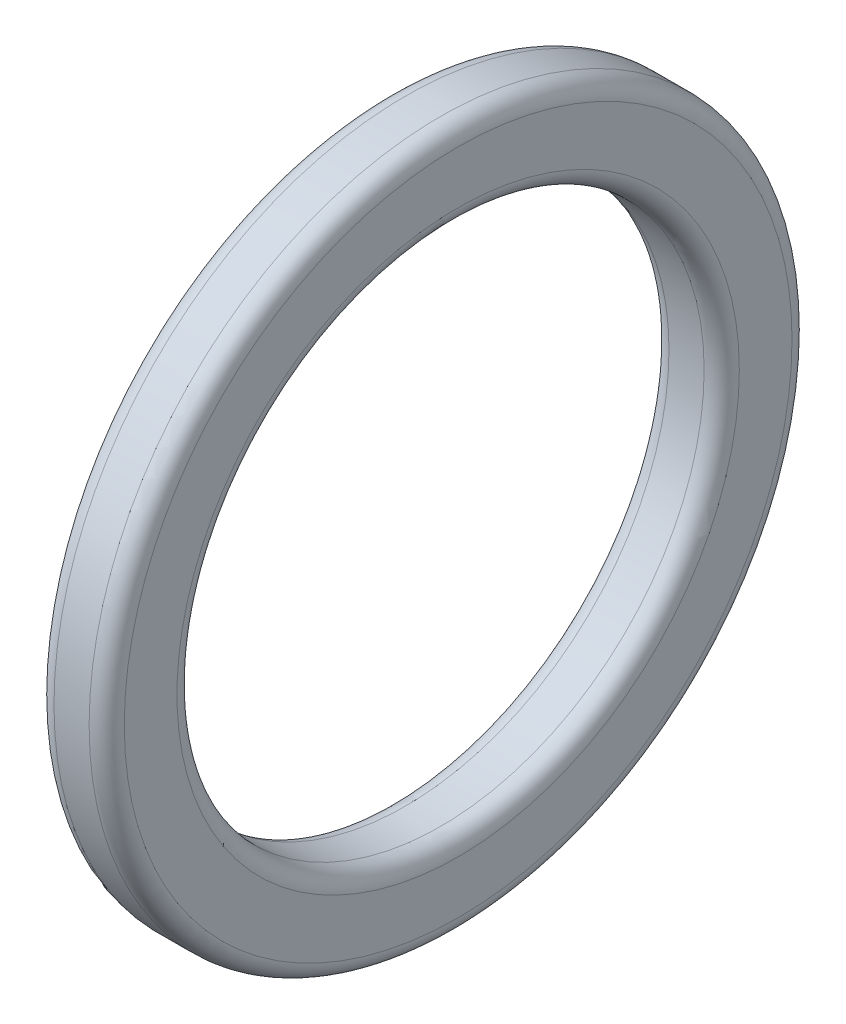
ISO-10303-21;
HEADER;
FILE_DESCRIPTION(('STEP AP214'),'2;1');
FILE_NAME('part.step','',(''),(''),'','','');
FILE_SCHEMA(('AUTOMOTIVE_DESIGN { 1 0 10303 214 1 1 1 1 }'));
ENDSEC;
DATA;
#1=APPLICATION_CONTEXT('core data for automotive mechanical design processes');
#2=APPLICATION_PROTOCOL_DEFINITION('international standard','automotive_design',2000,#1);
#3=PRODUCT_CONTEXT('',#1,'mechanical');
#4=PRODUCT('Part','Part','',(#3));
#5=PRODUCT_RELATED_PRODUCT_CATEGORY('part','',(#4));
#6=PRODUCT_DEFINITION_FORMATION('','',#4);
#7=PRODUCT_DEFINITION_CONTEXT('part definition',#1,'design');
#8=PRODUCT_DEFINITION('design','',#6,#7);
#9=PRODUCT_DEFINITION_SHAPE('','',#8);
#10=(LENGTH_UNIT() NAMED_UNIT(*) SI_UNIT(.MILLI.,.METRE.));
#11=(NAMED_UNIT(*) PLANE_ANGLE_UNIT() SI_UNIT($,.RADIAN.));
#12=(NAMED_UNIT(*) SI_UNIT($,.STERADIAN.) SOLID_ANGLE_UNIT());
#13=UNCERTAINTY_MEASURE_WITH_UNIT(LENGTH_MEASURE(1.E-05),#10,'distance_accuracy_value','');
#14=(GEOMETRIC_REPRESENTATION_CONTEXT(3) GLOBAL_UNCERTAINTY_ASSIGNED_CONTEXT((#13)) GLOBAL_UNIT_ASSIGNED_CONTEXT((#10,
#11,#12)) REPRESENTATION_CONTEXT('',''));
#15=CARTESIAN_POINT('',(0.,0.,0.));
#16=DIRECTION('',(0.,0.,1.));
#17=DIRECTION('',(1.,0.,0.));
#18=AXIS2_PLACEMENT_3D('',#15,#16,#17);
#19=CARTESIAN_POINT('',(0.,15.,0.));
#20=DIRECTION('',(-1.,0.,0.));
#21=DIRECTION('',(0.,0.,1.));
#22=AXIS2_PLACEMENT_3D('',#19,#20,#21);
#23=PLANE('',#22);
#24=CARTESIAN_POINT('',(0.,0.,0.));
#25=DIRECTION('',(-1.,0.,0.));
#26=DIRECTION('',(0.,0.,1.));
#27=AXIS2_PLACEMENT_3D('',#24,#25,#26);
#28=CIRCLE('',#27,19.);
#29=CARTESIAN_POINT('',(0.,0.,19.));
#30=VERTEX_POINT('',#29);
#31=EDGE_CURVE('E44',#30,#30,#28,.T.);
#32=ORIENTED_EDGE('',*,*,#31,.T.);
#33=EDGE_LOOP('',(#32));
#34=FACE_BOUND('',#33,.T.);
#35=CARTESIAN_POINT('',(0.,0.,0.));
#36=DIRECTION('',(-1.,0.,0.));
#37=DIRECTION('',(0.,0.,1.));
#38=AXIS2_PLACEMENT_3D('',#35,#36,#37);
#39=CIRCLE('',#38,16.);
#40=CARTESIAN_POINT('',(0.,0.,16.));
#41=VERTEX_POINT('',#40);
#42=EDGE_CURVE('E47',#41,#41,#39,.F.);
#43=ORIENTED_EDGE('',*,*,#42,.T.);
#44=EDGE_LOOP('',(#43));
#45=FACE_BOUND('',#44,.T.);
#46=ADVANCED_FACE('F34',(#34,#45),#23,.T.);
#47=CARTESIAN_POINT('',(0.,0.,0.));
#48=DIRECTION('',(1.,0.,0.));
#49=DIRECTION('',(0.,0.,-1.));
#50=AXIS2_PLACEMENT_3D('',#47,#48,#49);
#51=CYLINDRICAL_SURFACE('',#50,20.);
#52=CARTESIAN_POINT('',(3.,0.,0.));
#53=DIRECTION('',(1.,0.,0.));
#54=DIRECTION('',(0.,0.,-1.));
#55=AXIS2_PLACEMENT_3D('',#52,#53,#54);
#56=CIRCLE('',#55,20.);
#57=CARTESIAN_POINT('',(3.,0.,-20.));
#58=VERTEX_POINT('',#57);
#59=EDGE_CURVE('E53',#58,#58,#56,.F.);
#60=ORIENTED_EDGE('',*,*,#59,.T.);
#61=EDGE_LOOP('',(#60));
#62=FACE_BOUND('',#61,.T.);
#63=CARTESIAN_POINT('',(1.,0.,0.));
#64=DIRECTION('',(-1.,0.,0.));
#65=DIRECTION('',(0.,0.,1.));
#66=AXIS2_PLACEMENT_3D('',#63,#64,#65);
#67=CIRCLE('',#66,20.);
#68=CARTESIAN_POINT('',(1.,0.,20.));
#69=VERTEX_POINT('',#68);
#70=EDGE_CURVE('E60',#69,#69,#67,.F.);
#71=ORIENTED_EDGE('',*,*,#70,.T.);
#72=EDGE_LOOP('',(#71));
#73=FACE_BOUND('',#72,.T.);
#74=ADVANCED_FACE('F83',(#62,#73),#51,.T.);
#75=CARTESIAN_POINT('',(4.,15.,0.));
#76=DIRECTION('',(1.,0.,0.));
#77=DIRECTION('',(0.,0.,-1.));
#78=AXIS2_PLACEMENT_3D('',#75,#76,#77);
#79=PLANE('',#78);
#80=CARTESIAN_POINT('',(4.,0.,0.));
#81=DIRECTION('',(1.,0.,0.));
#82=DIRECTION('',(0.,0.,-1.));
#83=AXIS2_PLACEMENT_3D('',#80,#81,#82);
#84=CIRCLE('',#83,19.);
#85=CARTESIAN_POINT('',(4.,0.,-19.));
#86=VERTEX_POINT('',#85);
#87=EDGE_CURVE('E58',#86,#86,#84,.T.);
#88=ORIENTED_EDGE('',*,*,#87,.T.);
#89=EDGE_LOOP('',(#88));
#90=FACE_BOUND('',#89,.T.);
#91=CARTESIAN_POINT('',(4.,0.,0.));
#92=DIRECTION('',(1.,0.,0.));
#93=DIRECTION('',(0.,0.,-1.));
#94=AXIS2_PLACEMENT_3D('',#91,#92,#93);
#95=CIRCLE('',#94,16.);
#96=CARTESIAN_POINT('',(4.,0.,-16.));
#97=VERTEX_POINT('',#96);
#98=EDGE_CURVE('E62',#97,#97,#95,.F.);
#99=ORIENTED_EDGE('',*,*,#98,.T.);
#100=EDGE_LOOP('',(#99));
#101=FACE_BOUND('',#100,.T.);
#102=ADVANCED_FACE('F70',(#90,#101),#79,.T.);
#103=CARTESIAN_POINT('',(0.,0.,0.));
#104=DIRECTION('',(1.,0.,0.));
#105=DIRECTION('',(0.,0.,-1.));
#106=AXIS2_PLACEMENT_3D('',#103,#104,#105);
#107=CYLINDRICAL_SURFACE('',#106,15.);
#108=CARTESIAN_POINT('',(1.,0.,0.));
#109=DIRECTION('',(-1.,0.,0.));
#110=DIRECTION('',(0.,0.,1.));
#111=AXIS2_PLACEMENT_3D('',#108,#109,#110);
#112=CIRCLE('',#111,15.);
#113=CARTESIAN_POINT('',(1.,0.,15.));
#114=VERTEX_POINT('',#113);
#115=EDGE_CURVE('E10',#114,#114,#112,.T.);
#116=ORIENTED_EDGE('',*,*,#115,.T.);
#117=EDGE_LOOP('',(#116));
#118=FACE_BOUND('',#117,.T.);
#119=CARTESIAN_POINT('',(3.,0.,0.));
#120=DIRECTION('',(1.,0.,0.));
#121=DIRECTION('',(0.,0.,-1.));
#122=AXIS2_PLACEMENT_3D('',#119,#120,#121);
#123=CIRCLE('',#122,15.);
#124=CARTESIAN_POINT('',(3.,0.,-15.));
#125=VERTEX_POINT('',#124);
#126=EDGE_CURVE('E41',#125,#125,#123,.T.);
#127=ORIENTED_EDGE('',*,*,#126,.T.);
#128=EDGE_LOOP('',(#127));
#129=FACE_BOUND('',#128,.T.);
#130=ADVANCED_FACE('F102',(#118,#129),#107,.F.);
#131=CARTESIAN_POINT('',(3.,0.,0.));
#132=DIRECTION('',(1.,0.,0.));
#133=DIRECTION('',(0.,0.,-1.));
#134=AXIS2_PLACEMENT_3D('',#131,#132,#133);
#135=TOROIDAL_SURFACE('',#134,19.,1.);
#136=ORIENTED_EDGE('',*,*,#59,.F.);
#137=EDGE_LOOP('',(#136));
#138=FACE_BOUND('',#137,.T.);
#139=ORIENTED_EDGE('',*,*,#87,.F.);
#140=EDGE_LOOP('',(#139));
#141=FACE_BOUND('',#140,.T.);
#142=ADVANCED_FACE('F92',(#138,#141),#135,.T.);
#143=CARTESIAN_POINT('',(1.,0.,0.));
#144=DIRECTION('',(-1.,0.,0.));
#145=DIRECTION('',(0.,0.,1.));
#146=AXIS2_PLACEMENT_3D('',#143,#144,#145);
#147=TOROIDAL_SURFACE('',#146,19.,1.);
#148=ORIENTED_EDGE('',*,*,#31,.F.);
#149=EDGE_LOOP('',(#148));
#150=FACE_BOUND('',#149,.T.);
#151=ORIENTED_EDGE('',*,*,#70,.F.);
#152=EDGE_LOOP('',(#151));
#153=FACE_BOUND('',#152,.T.);
#154=ADVANCED_FACE('F77',(#150,#153),#147,.T.);
#155=CARTESIAN_POINT('',(1.,0.,0.));
#156=DIRECTION('',(-1.,0.,0.));
#157=DIRECTION('',(0.,0.,1.));
#158=AXIS2_PLACEMENT_3D('',#155,#156,#157);
#159=TOROIDAL_SURFACE('',#158,16.,1.);
#160=ORIENTED_EDGE('',*,*,#115,.F.);
#161=EDGE_LOOP('',(#160));
#162=FACE_BOUND('',#161,.T.);
#163=ORIENTED_EDGE('',*,*,#42,.F.);
#164=EDGE_LOOP('',(#163));
#165=FACE_BOUND('',#164,.T.);
#166=ADVANCED_FACE('F71',(#162,#165),#159,.T.);
#167=CARTESIAN_POINT('',(3.,0.,0.));
#168=DIRECTION('',(1.,0.,0.));
#169=DIRECTION('',(0.,0.,-1.));
#170=AXIS2_PLACEMENT_3D('',#167,#168,#169);
#171=TOROIDAL_SURFACE('',#170,16.,1.);
#172=ORIENTED_EDGE('',*,*,#98,.F.);
#173=EDGE_LOOP('',(#172));
#174=FACE_BOUND('',#173,.T.);
#175=ORIENTED_EDGE('',*,*,#126,.F.);
#176=EDGE_LOOP('',(#175));
#177=FACE_BOUND('',#176,.T.);
#178=ADVANCED_FACE('F69',(#174,#177),#171,.T.);
#179=CLOSED_SHELL('',(#46,#74,#102,#130,#142,#154,#166,#178));
#180=MANIFOLD_SOLID_BREP('B2',#179);
#181=ADVANCED_BREP_SHAPE_REPRESENTATION('',(#18,#180),#14);
#182=SHAPE_DEFINITION_REPRESENTATION(#9,#181);
ENDSEC;
END-ISO-10303-21;
